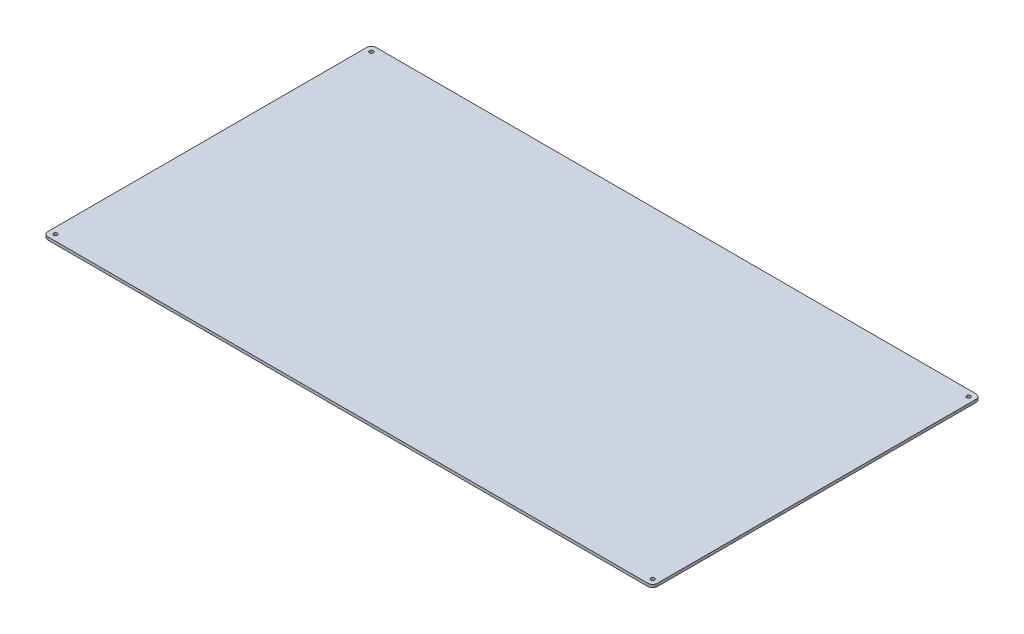
ISO-10303-21;
HEADER;
FILE_DESCRIPTION(('STEP AP214'),'2;1');
FILE_NAME('part.step','',(''),(''),'','','');
FILE_SCHEMA(('AUTOMOTIVE_DESIGN { 1 0 10303 214 1 1 1 1 }'));
ENDSEC;
DATA;
#1=APPLICATION_CONTEXT('core data for automotive mechanical design processes');
#2=APPLICATION_PROTOCOL_DEFINITION('international standard','automotive_design',2000,#1);
#3=PRODUCT_CONTEXT('',#1,'mechanical');
#4=PRODUCT('Part','Part','',(#3));
#5=PRODUCT_RELATED_PRODUCT_CATEGORY('part','',(#4));
#6=PRODUCT_DEFINITION_FORMATION('','',#4);
#7=PRODUCT_DEFINITION_CONTEXT('part definition',#1,'design');
#8=PRODUCT_DEFINITION('design','',#6,#7);
#9=PRODUCT_DEFINITION_SHAPE('','',#8);
#10=(LENGTH_UNIT() NAMED_UNIT(*) SI_UNIT(.MILLI.,.METRE.));
#11=(NAMED_UNIT(*) PLANE_ANGLE_UNIT() SI_UNIT($,.RADIAN.));
#12=(NAMED_UNIT(*) SI_UNIT($,.STERADIAN.) SOLID_ANGLE_UNIT());
#13=UNCERTAINTY_MEASURE_WITH_UNIT(LENGTH_MEASURE(1.E-05),#10,'distance_accuracy_value','');
#14=(GEOMETRIC_REPRESENTATION_CONTEXT(3) GLOBAL_UNCERTAINTY_ASSIGNED_CONTEXT((#13)) GLOBAL_UNIT_ASSIGNED_CONTEXT((#10,
#11,#12)) REPRESENTATION_CONTEXT('',''));
#15=CARTESIAN_POINT('',(0.,0.,0.));
#16=DIRECTION('',(0.,0.,1.));
#17=DIRECTION('',(1.,0.,0.));
#18=AXIS2_PLACEMENT_3D('',#15,#16,#17);
#19=CARTESIAN_POINT('',(645.,3.,-345.));
#20=DIRECTION('',(0.,1.,0.));
#21=DIRECTION('',(0.,0.,1.));
#22=AXIS2_PLACEMENT_3D('',#19,#20,#21);
#23=PLANE('',#22);
#24=CARTESIAN_POINT('',(643.5,3.,-6.5));
#25=DIRECTION('',(0.,1.,0.));
#26=DIRECTION('',(0.,0.,1.));
#27=AXIS2_PLACEMENT_3D('',#24,#25,#26);
#28=CIRCLE('',#27,2.);
#29=CARTESIAN_POINT('',(643.5,3.,-4.5));
#30=VERTEX_POINT('',#29);
#31=EDGE_CURVE('E190',#30,#30,#28,.T.);
#32=ORIENTED_EDGE('',*,*,#31,.F.);
#33=EDGE_LOOP('',(#32));
#34=FACE_BOUND('',#33,.T.);
#35=CARTESIAN_POINT('',(6.5,3.,-343.5));
#36=DIRECTION('',(0.,1.,0.));
#37=DIRECTION('',(0.,0.,1.));
#38=AXIS2_PLACEMENT_3D('',#35,#36,#37);
#39=CIRCLE('',#38,2.);
#40=CARTESIAN_POINT('',(6.5,3.,-341.5));
#41=VERTEX_POINT('',#40);
#42=EDGE_CURVE('E136',#41,#41,#39,.T.);
#43=ORIENTED_EDGE('',*,*,#42,.F.);
#44=EDGE_LOOP('',(#43));
#45=FACE_BOUND('',#44,.T.);
#46=CARTESIAN_POINT('',(645.,3.,-345.));
#47=DIRECTION('',(0.,1.,0.));
#48=DIRECTION('',(0.,0.,1.));
#49=AXIS2_PLACEMENT_3D('',#46,#47,#48);
#50=CIRCLE('',#49,5.);
#51=CARTESIAN_POINT('',(650.,3.,-345.));
#52=VERTEX_POINT('',#51);
#53=CARTESIAN_POINT('',(645.,3.,-350.));
#54=VERTEX_POINT('',#53);
#55=EDGE_CURVE('E147',#52,#54,#50,.T.);
#56=ORIENTED_EDGE('',*,*,#55,.T.);
#57=DIRECTION('',(-1.,0.,0.));
#58=VECTOR('',#57,1.);
#59=CARTESIAN_POINT('',(5.00000000000003,3.,-350.));
#60=LINE('',#59,#58);
#61=CARTESIAN_POINT('',(5.,3.,-350.));
#62=VERTEX_POINT('',#61);
#63=EDGE_CURVE('E95',#54,#62,#60,.T.);
#64=ORIENTED_EDGE('',*,*,#63,.T.);
#65=CARTESIAN_POINT('',(5.,3.,-345.));
#66=DIRECTION('',(0.,1.,0.));
#67=DIRECTION('',(0.,0.,-1.));
#68=AXIS2_PLACEMENT_3D('',#65,#66,#67);
#69=CIRCLE('',#68,5.);
#70=CARTESIAN_POINT('',(0.,3.,-345.));
#71=VERTEX_POINT('',#70);
#72=EDGE_CURVE('E162',#62,#71,#69,.T.);
#73=ORIENTED_EDGE('',*,*,#72,.T.);
#74=DIRECTION('',(0.,0.,1.));
#75=VECTOR('',#74,1.);
#76=CARTESIAN_POINT('',(0.,3.,-5.00000000000004));
#77=LINE('',#76,#75);
#78=CARTESIAN_POINT('',(0.,3.,-5.00000000000004));
#79=VERTEX_POINT('',#78);
#80=EDGE_CURVE('E175',#71,#79,#77,.T.);
#81=ORIENTED_EDGE('',*,*,#80,.T.);
#82=CARTESIAN_POINT('',(5.,3.,-5.));
#83=DIRECTION('',(0.,1.,0.));
#84=DIRECTION('',(0.,0.,-1.));
#85=AXIS2_PLACEMENT_3D('',#82,#83,#84);
#86=CIRCLE('',#85,5.);
#87=CARTESIAN_POINT('',(5.00000000000003,3.,0.));
#88=VERTEX_POINT('',#87);
#89=EDGE_CURVE('E114',#79,#88,#86,.T.);
#90=ORIENTED_EDGE('',*,*,#89,.T.);
#91=DIRECTION('',(1.,0.,0.));
#92=VECTOR('',#91,1.);
#93=CARTESIAN_POINT('',(5.00000000000003,3.,0.));
#94=LINE('',#93,#92);
#95=CARTESIAN_POINT('',(645.,3.,0.));
#96=VERTEX_POINT('',#95);
#97=EDGE_CURVE('E108',#88,#96,#94,.T.);
#98=ORIENTED_EDGE('',*,*,#97,.T.);
#99=CARTESIAN_POINT('',(645.,3.,-5.));
#100=DIRECTION('',(0.,1.,0.));
#101=DIRECTION('',(0.,0.,1.));
#102=AXIS2_PLACEMENT_3D('',#99,#100,#101);
#103=CIRCLE('',#102,5.);
#104=CARTESIAN_POINT('',(650.,3.,-5.00000000000004));
#105=VERTEX_POINT('',#104);
#106=EDGE_CURVE('E112',#96,#105,#103,.T.);
#107=ORIENTED_EDGE('',*,*,#106,.T.);
#108=DIRECTION('',(0.,0.,-1.));
#109=VECTOR('',#108,1.);
#110=CARTESIAN_POINT('',(650.,3.,-5.00000000000004));
#111=LINE('',#110,#109);
#112=EDGE_CURVE('E52',#105,#52,#111,.T.);
#113=ORIENTED_EDGE('',*,*,#112,.T.);
#114=EDGE_LOOP('',(#56,#64,#73,#81,#90,#98,#107,#113));
#115=FACE_BOUND('',#114,.T.);
#116=CARTESIAN_POINT('',(643.5,3.,-343.5));
#117=DIRECTION('',(0.,1.,0.));
#118=DIRECTION('',(0.,0.,1.));
#119=AXIS2_PLACEMENT_3D('',#116,#117,#118);
#120=CIRCLE('',#119,2.);
#121=CARTESIAN_POINT('',(643.5,3.,-341.5));
#122=VERTEX_POINT('',#121);
#123=EDGE_CURVE('E184',#122,#122,#120,.T.);
#124=ORIENTED_EDGE('',*,*,#123,.F.);
#125=EDGE_LOOP('',(#124));
#126=FACE_BOUND('',#125,.T.);
#127=CARTESIAN_POINT('',(6.5,3.,-6.5));
#128=DIRECTION('',(0.,1.,0.));
#129=DIRECTION('',(0.,0.,1.));
#130=AXIS2_PLACEMENT_3D('',#127,#128,#129);
#131=CIRCLE('',#130,2.);
#132=CARTESIAN_POINT('',(6.5,3.,-4.49999999999999));
#133=VERTEX_POINT('',#132);
#134=EDGE_CURVE('E196',#133,#133,#131,.T.);
#135=ORIENTED_EDGE('',*,*,#134,.F.);
#136=EDGE_LOOP('',(#135));
#137=FACE_BOUND('',#136,.T.);
#138=ADVANCED_FACE('F35',(#34,#45,#115,#126,#137),#23,.T.);
#139=CARTESIAN_POINT('',(645.,0.,-345.));
#140=DIRECTION('',(0.,1.,0.));
#141=DIRECTION('',(0.,0.,1.));
#142=AXIS2_PLACEMENT_3D('',#139,#140,#141);
#143=PLANE('',#142);
#144=CARTESIAN_POINT('',(645.,0.,-345.));
#145=DIRECTION('',(0.,1.,0.));
#146=DIRECTION('',(0.,0.,1.));
#147=AXIS2_PLACEMENT_3D('',#144,#145,#146);
#148=CIRCLE('',#147,5.);
#149=CARTESIAN_POINT('',(650.,0.,-345.));
#150=VERTEX_POINT('',#149);
#151=CARTESIAN_POINT('',(645.,0.,-350.));
#152=VERTEX_POINT('',#151);
#153=EDGE_CURVE('E132',#150,#152,#148,.T.);
#154=ORIENTED_EDGE('',*,*,#153,.F.);
#155=DIRECTION('',(0.,0.,-1.));
#156=VECTOR('',#155,1.);
#157=CARTESIAN_POINT('',(650.,0.,-5.00000000000004));
#158=LINE('',#157,#156);
#159=CARTESIAN_POINT('',(650.,0.,-5.00000000000004));
#160=VERTEX_POINT('',#159);
#161=EDGE_CURVE('E87',#160,#150,#158,.T.);
#162=ORIENTED_EDGE('',*,*,#161,.F.);
#163=CARTESIAN_POINT('',(645.,0.,-5.));
#164=DIRECTION('',(0.,1.,0.));
#165=DIRECTION('',(0.,0.,1.));
#166=AXIS2_PLACEMENT_3D('',#163,#164,#165);
#167=CIRCLE('',#166,5.);
#168=CARTESIAN_POINT('',(645.,0.,0.));
#169=VERTEX_POINT('',#168);
#170=EDGE_CURVE('E81',#169,#160,#167,.T.);
#171=ORIENTED_EDGE('',*,*,#170,.F.);
#172=DIRECTION('',(1.,0.,0.));
#173=VECTOR('',#172,1.);
#174=CARTESIAN_POINT('',(5.00000000000003,0.,0.));
#175=LINE('',#174,#173);
#176=CARTESIAN_POINT('',(5.00000000000003,0.,0.));
#177=VERTEX_POINT('',#176);
#178=EDGE_CURVE('E122',#177,#169,#175,.T.);
#179=ORIENTED_EDGE('',*,*,#178,.F.);
#180=CARTESIAN_POINT('',(5.,0.,-5.));
#181=DIRECTION('',(0.,1.,0.));
#182=DIRECTION('',(0.,0.,-1.));
#183=AXIS2_PLACEMENT_3D('',#180,#181,#182);
#184=CIRCLE('',#183,5.);
#185=CARTESIAN_POINT('',(0.,0.,-5.00000000000004));
#186=VERTEX_POINT('',#185);
#187=EDGE_CURVE('E142',#186,#177,#184,.T.);
#188=ORIENTED_EDGE('',*,*,#187,.F.);
#189=DIRECTION('',(0.,0.,1.));
#190=VECTOR('',#189,1.);
#191=CARTESIAN_POINT('',(0.,0.,-5.00000000000004));
#192=LINE('',#191,#190);
#193=CARTESIAN_POINT('',(0.,0.,-345.));
#194=VERTEX_POINT('',#193);
#195=EDGE_CURVE('E140',#194,#186,#192,.T.);
#196=ORIENTED_EDGE('',*,*,#195,.F.);
#197=CARTESIAN_POINT('',(5.,0.,-345.));
#198=DIRECTION('',(0.,1.,0.));
#199=DIRECTION('',(0.,0.,-1.));
#200=AXIS2_PLACEMENT_3D('',#197,#198,#199);
#201=CIRCLE('',#200,5.);
#202=CARTESIAN_POINT('',(5.,0.,-350.));
#203=VERTEX_POINT('',#202);
#204=EDGE_CURVE('E138',#203,#194,#201,.T.);
#205=ORIENTED_EDGE('',*,*,#204,.F.);
#206=DIRECTION('',(-1.,0.,0.));
#207=VECTOR('',#206,1.);
#208=CARTESIAN_POINT('',(5.00000000000003,0.,-350.));
#209=LINE('',#208,#207);
#210=EDGE_CURVE('E135',#152,#203,#209,.T.);
#211=ORIENTED_EDGE('',*,*,#210,.F.);
#212=EDGE_LOOP('',(#154,#162,#171,#179,#188,#196,#205,#211));
#213=FACE_BOUND('',#212,.T.);
#214=CARTESIAN_POINT('',(6.5,0.,-343.5));
#215=DIRECTION('',(0.,1.,0.));
#216=DIRECTION('',(0.,0.,1.));
#217=AXIS2_PLACEMENT_3D('',#214,#215,#216);
#218=CIRCLE('',#217,2.);
#219=CARTESIAN_POINT('',(6.5,0.,-341.5));
#220=VERTEX_POINT('',#219);
#221=EDGE_CURVE('E181',#220,#220,#218,.T.);
#222=ORIENTED_EDGE('',*,*,#221,.T.);
#223=EDGE_LOOP('',(#222));
#224=FACE_BOUND('',#223,.T.);
#225=CARTESIAN_POINT('',(643.5,0.,-343.5));
#226=DIRECTION('',(0.,1.,0.));
#227=DIRECTION('',(0.,0.,1.));
#228=AXIS2_PLACEMENT_3D('',#225,#226,#227);
#229=CIRCLE('',#228,2.);
#230=CARTESIAN_POINT('',(643.5,0.,-341.5));
#231=VERTEX_POINT('',#230);
#232=EDGE_CURVE('E187',#231,#231,#229,.T.);
#233=ORIENTED_EDGE('',*,*,#232,.T.);
#234=EDGE_LOOP('',(#233));
#235=FACE_BOUND('',#234,.T.);
#236=CARTESIAN_POINT('',(643.5,0.,-6.5));
#237=DIRECTION('',(0.,1.,0.));
#238=DIRECTION('',(0.,0.,1.));
#239=AXIS2_PLACEMENT_3D('',#236,#237,#238);
#240=CIRCLE('',#239,2.);
#241=CARTESIAN_POINT('',(643.5,0.,-4.5));
#242=VERTEX_POINT('',#241);
#243=EDGE_CURVE('E193',#242,#242,#240,.T.);
#244=ORIENTED_EDGE('',*,*,#243,.T.);
#245=EDGE_LOOP('',(#244));
#246=FACE_BOUND('',#245,.T.);
#247=CARTESIAN_POINT('',(6.5,0.,-6.5));
#248=DIRECTION('',(0.,1.,0.));
#249=DIRECTION('',(0.,0.,1.));
#250=AXIS2_PLACEMENT_3D('',#247,#248,#249);
#251=CIRCLE('',#250,2.);
#252=CARTESIAN_POINT('',(6.5,0.,-4.49999999999999));
#253=VERTEX_POINT('',#252);
#254=EDGE_CURVE('E199',#253,#253,#251,.T.);
#255=ORIENTED_EDGE('',*,*,#254,.T.);
#256=EDGE_LOOP('',(#255));
#257=FACE_BOUND('',#256,.T.);
#258=ADVANCED_FACE('F166',(#213,#224,#235,#246,#257),#143,.F.);
#259=CARTESIAN_POINT('',(645.,3.,-345.));
#260=DIRECTION('',(0.,-1.,0.));
#261=DIRECTION('',(0.,0.,-1.));
#262=AXIS2_PLACEMENT_3D('',#259,#260,#261);
#263=CYLINDRICAL_SURFACE('',#262,5.);
#264=ORIENTED_EDGE('',*,*,#153,.T.);
#265=DIRECTION('',(0.,-1.,0.));
#266=VECTOR('',#265,1.);
#267=CARTESIAN_POINT('',(645.,3.,-350.));
#268=LINE('',#267,#266);
#269=EDGE_CURVE('E11',#54,#152,#268,.T.);
#270=ORIENTED_EDGE('',*,*,#269,.F.);
#271=ORIENTED_EDGE('',*,*,#55,.F.);
#272=DIRECTION('',(0.,-1.,0.));
#273=VECTOR('',#272,1.);
#274=CARTESIAN_POINT('',(650.,3.,-345.));
#275=LINE('',#274,#273);
#276=EDGE_CURVE('E128',#52,#150,#275,.T.);
#277=ORIENTED_EDGE('',*,*,#276,.T.);
#278=EDGE_LOOP('',(#264,#270,#271,#277));
#279=FACE_BOUND('',#278,.T.);
#280=ADVANCED_FACE('F37',(#279),#263,.T.);
#281=CARTESIAN_POINT('',(5.00000000000003,3.,-350.));
#282=DIRECTION('',(0.,0.,1.));
#283=DIRECTION('',(1.,0.,0.));
#284=AXIS2_PLACEMENT_3D('',#281,#282,#283);
#285=PLANE('',#284);
#286=ORIENTED_EDGE('',*,*,#210,.T.);
#287=DIRECTION('',(0.,-1.,0.));
#288=VECTOR('',#287,1.);
#289=CARTESIAN_POINT('',(5.,3.,-350.));
#290=LINE('',#289,#288);
#291=EDGE_CURVE('E44',#62,#203,#290,.T.);
#292=ORIENTED_EDGE('',*,*,#291,.F.);
#293=ORIENTED_EDGE('',*,*,#63,.F.);
#294=ORIENTED_EDGE('',*,*,#269,.T.);
#295=EDGE_LOOP('',(#286,#292,#293,#294));
#296=FACE_BOUND('',#295,.T.);
#297=ADVANCED_FACE('F233',(#296),#285,.F.);
#298=CARTESIAN_POINT('',(5.,3.,-345.));
#299=DIRECTION('',(0.,-1.,0.));
#300=DIRECTION('',(0.,0.,-1.));
#301=AXIS2_PLACEMENT_3D('',#298,#299,#300);
#302=CYLINDRICAL_SURFACE('',#301,5.);
#303=ORIENTED_EDGE('',*,*,#204,.T.);
#304=DIRECTION('',(0.,-1.,0.));
#305=VECTOR('',#304,1.);
#306=CARTESIAN_POINT('',(0.,3.,-345.));
#307=LINE('',#306,#305);
#308=EDGE_CURVE('E154',#71,#194,#307,.T.);
#309=ORIENTED_EDGE('',*,*,#308,.F.);
#310=ORIENTED_EDGE('',*,*,#72,.F.);
#311=ORIENTED_EDGE('',*,*,#291,.T.);
#312=EDGE_LOOP('',(#303,#309,#310,#311));
#313=FACE_BOUND('',#312,.T.);
#314=ADVANCED_FACE('F160',(#313),#302,.T.);
#315=CARTESIAN_POINT('',(0.,3.,-5.00000000000004));
#316=DIRECTION('',(1.,0.,0.));
#317=DIRECTION('',(0.,0.,-1.));
#318=AXIS2_PLACEMENT_3D('',#315,#316,#317);
#319=PLANE('',#318);
#320=ORIENTED_EDGE('',*,*,#195,.T.);
#321=DIRECTION('',(0.,-1.,0.));
#322=VECTOR('',#321,1.);
#323=CARTESIAN_POINT('',(0.,3.,-5.00000000000004));
#324=LINE('',#323,#322);
#325=EDGE_CURVE('E151',#79,#186,#324,.T.);
#326=ORIENTED_EDGE('',*,*,#325,.F.);
#327=ORIENTED_EDGE('',*,*,#80,.F.);
#328=ORIENTED_EDGE('',*,*,#308,.T.);
#329=EDGE_LOOP('',(#320,#326,#327,#328));
#330=FACE_BOUND('',#329,.T.);
#331=ADVANCED_FACE('F171',(#330),#319,.F.);
#332=CARTESIAN_POINT('',(5.,3.,-5.));
#333=DIRECTION('',(0.,-1.,0.));
#334=DIRECTION('',(0.,0.,-1.));
#335=AXIS2_PLACEMENT_3D('',#332,#333,#334);
#336=CYLINDRICAL_SURFACE('',#335,5.);
#337=ORIENTED_EDGE('',*,*,#187,.T.);
#338=DIRECTION('',(0.,-1.,0.));
#339=VECTOR('',#338,1.);
#340=CARTESIAN_POINT('',(5.00000000000003,3.,0.));
#341=LINE('',#340,#339);
#342=EDGE_CURVE('E123',#88,#177,#341,.T.);
#343=ORIENTED_EDGE('',*,*,#342,.F.);
#344=ORIENTED_EDGE('',*,*,#89,.F.);
#345=ORIENTED_EDGE('',*,*,#325,.T.);
#346=EDGE_LOOP('',(#337,#343,#344,#345));
#347=FACE_BOUND('',#346,.T.);
#348=ADVANCED_FACE('F174',(#347),#336,.T.);
#349=CARTESIAN_POINT('',(5.00000000000003,3.,0.));
#350=DIRECTION('',(0.,0.,-1.));
#351=DIRECTION('',(-1.,0.,0.));
#352=AXIS2_PLACEMENT_3D('',#349,#350,#351);
#353=PLANE('',#352);
#354=ORIENTED_EDGE('',*,*,#178,.T.);
#355=DIRECTION('',(0.,-1.,0.));
#356=VECTOR('',#355,1.);
#357=CARTESIAN_POINT('',(645.,3.,0.));
#358=LINE('',#357,#356);
#359=EDGE_CURVE('E119',#96,#169,#358,.T.);
#360=ORIENTED_EDGE('',*,*,#359,.F.);
#361=ORIENTED_EDGE('',*,*,#97,.F.);
#362=ORIENTED_EDGE('',*,*,#342,.T.);
#363=EDGE_LOOP('',(#354,#360,#361,#362));
#364=FACE_BOUND('',#363,.T.);
#365=ADVANCED_FACE('F120',(#364),#353,.F.);
#366=CARTESIAN_POINT('',(645.,3.,-5.));
#367=DIRECTION('',(0.,-1.,0.));
#368=DIRECTION('',(0.,0.,-1.));
#369=AXIS2_PLACEMENT_3D('',#366,#367,#368);
#370=CYLINDRICAL_SURFACE('',#369,5.);
#371=ORIENTED_EDGE('',*,*,#170,.T.);
#372=DIRECTION('',(0.,-1.,0.));
#373=VECTOR('',#372,1.);
#374=CARTESIAN_POINT('',(650.,3.,-5.00000000000004));
#375=LINE('',#374,#373);
#376=EDGE_CURVE('E124',#105,#160,#375,.T.);
#377=ORIENTED_EDGE('',*,*,#376,.F.);
#378=ORIENTED_EDGE('',*,*,#106,.F.);
#379=ORIENTED_EDGE('',*,*,#359,.T.);
#380=EDGE_LOOP('',(#371,#377,#378,#379));
#381=FACE_BOUND('',#380,.T.);
#382=ADVANCED_FACE('F126',(#381),#370,.T.);
#383=CARTESIAN_POINT('',(650.,3.,-5.00000000000004));
#384=DIRECTION('',(-1.,0.,0.));
#385=DIRECTION('',(0.,0.,1.));
#386=AXIS2_PLACEMENT_3D('',#383,#384,#385);
#387=PLANE('',#386);
#388=ORIENTED_EDGE('',*,*,#161,.T.);
#389=ORIENTED_EDGE('',*,*,#276,.F.);
#390=ORIENTED_EDGE('',*,*,#112,.F.);
#391=ORIENTED_EDGE('',*,*,#376,.T.);
#392=EDGE_LOOP('',(#388,#389,#390,#391));
#393=FACE_BOUND('',#392,.T.);
#394=ADVANCED_FACE('F221',(#393),#387,.F.);
#395=CARTESIAN_POINT('',(6.5,3.,-343.5));
#396=DIRECTION('',(0.,-1.,0.));
#397=DIRECTION('',(0.,0.,-1.));
#398=AXIS2_PLACEMENT_3D('',#395,#396,#397);
#399=CYLINDRICAL_SURFACE('',#398,2.);
#400=ORIENTED_EDGE('',*,*,#42,.T.);
#401=EDGE_LOOP('',(#400));
#402=FACE_BOUND('',#401,.T.);
#403=ORIENTED_EDGE('',*,*,#221,.F.);
#404=EDGE_LOOP('',(#403));
#405=FACE_BOUND('',#404,.T.);
#406=ADVANCED_FACE('F218',(#402,#405),#399,.F.);
#407=CARTESIAN_POINT('',(643.5,3.,-343.5));
#408=DIRECTION('',(0.,-1.,0.));
#409=DIRECTION('',(0.,0.,-1.));
#410=AXIS2_PLACEMENT_3D('',#407,#408,#409);
#411=CYLINDRICAL_SURFACE('',#410,2.);
#412=ORIENTED_EDGE('',*,*,#123,.T.);
#413=EDGE_LOOP('',(#412));
#414=FACE_BOUND('',#413,.T.);
#415=ORIENTED_EDGE('',*,*,#232,.F.);
#416=EDGE_LOOP('',(#415));
#417=FACE_BOUND('',#416,.T.);
#418=ADVANCED_FACE('F297',(#414,#417),#411,.F.);
#419=CARTESIAN_POINT('',(643.5,3.,-6.5));
#420=DIRECTION('',(0.,-1.,0.));
#421=DIRECTION('',(0.,0.,-1.));
#422=AXIS2_PLACEMENT_3D('',#419,#420,#421);
#423=CYLINDRICAL_SURFACE('',#422,2.);
#424=ORIENTED_EDGE('',*,*,#31,.T.);
#425=EDGE_LOOP('',(#424));
#426=FACE_BOUND('',#425,.T.);
#427=ORIENTED_EDGE('',*,*,#243,.F.);
#428=EDGE_LOOP('',(#427));
#429=FACE_BOUND('',#428,.T.);
#430=ADVANCED_FACE('F305',(#426,#429),#423,.F.);
#431=CARTESIAN_POINT('',(6.5,3.,-6.5));
#432=DIRECTION('',(0.,-1.,0.));
#433=DIRECTION('',(0.,0.,-1.));
#434=AXIS2_PLACEMENT_3D('',#431,#432,#433);
#435=CYLINDRICAL_SURFACE('',#434,2.);
#436=ORIENTED_EDGE('',*,*,#134,.T.);
#437=EDGE_LOOP('',(#436));
#438=FACE_BOUND('',#437,.T.);
#439=ORIENTED_EDGE('',*,*,#254,.F.);
#440=EDGE_LOOP('',(#439));
#441=FACE_BOUND('',#440,.T.);
#442=ADVANCED_FACE('F205',(#438,#441),#435,.F.);
#443=CLOSED_SHELL('',(#138,#258,#280,#297,#314,#331,#348,#365,#382,#394,#406,#418,#430,#442));
#444=MANIFOLD_SOLID_BREP('B2',#443);
#445=ADVANCED_BREP_SHAPE_REPRESENTATION('',(#18,#444),#14);
#446=SHAPE_DEFINITION_REPRESENTATION(#9,#445);
ENDSEC;
END-ISO-10303-21;
